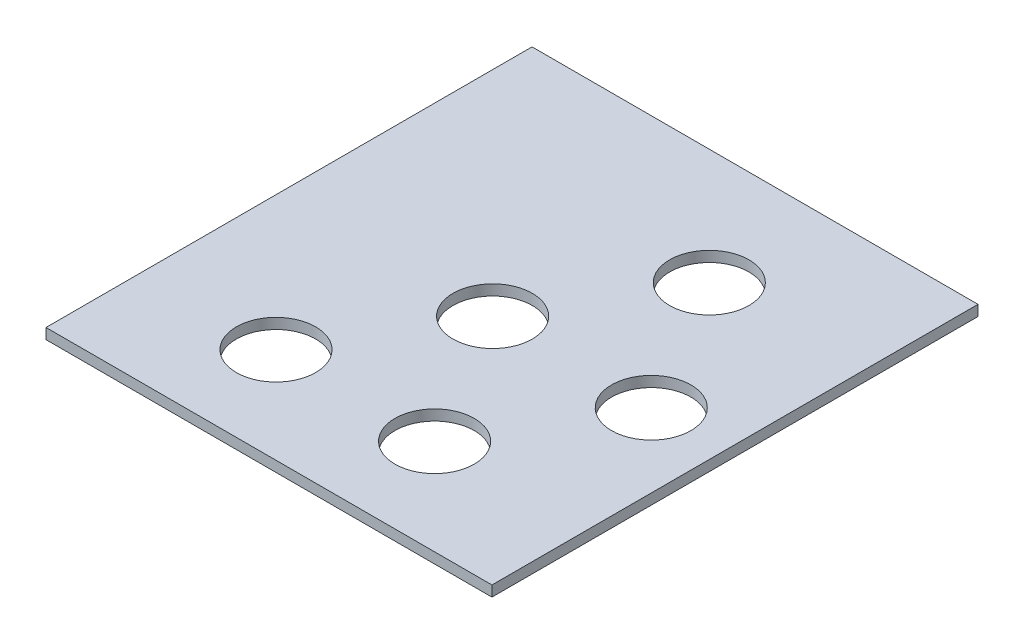
ISO-10303-21;
HEADER;
FILE_DESCRIPTION(('STEP AP214'),'2;1');
FILE_NAME('part.step','',(''),(''),'','','');
FILE_SCHEMA(('AUTOMOTIVE_DESIGN { 1 0 10303 214 1 1 1 1 }'));
ENDSEC;
DATA;
#1=APPLICATION_CONTEXT('core data for automotive mechanical design processes');
#2=APPLICATION_PROTOCOL_DEFINITION('international standard','automotive_design',2000,#1);
#3=PRODUCT_CONTEXT('',#1,'mechanical');
#4=PRODUCT('Part','Part','',(#3));
#5=PRODUCT_RELATED_PRODUCT_CATEGORY('part','',(#4));
#6=PRODUCT_DEFINITION_FORMATION('','',#4);
#7=PRODUCT_DEFINITION_CONTEXT('part definition',#1,'design');
#8=PRODUCT_DEFINITION('design','',#6,#7);
#9=PRODUCT_DEFINITION_SHAPE('','',#8);
#10=(LENGTH_UNIT() NAMED_UNIT(*) SI_UNIT(.MILLI.,.METRE.));
#11=(NAMED_UNIT(*) PLANE_ANGLE_UNIT() SI_UNIT($,.RADIAN.));
#12=(NAMED_UNIT(*) SI_UNIT($,.STERADIAN.) SOLID_ANGLE_UNIT());
#13=UNCERTAINTY_MEASURE_WITH_UNIT(LENGTH_MEASURE(1.E-05),#10,'distance_accuracy_value','');
#14=(GEOMETRIC_REPRESENTATION_CONTEXT(3) GLOBAL_UNCERTAINTY_ASSIGNED_CONTEXT((#13)) GLOBAL_UNIT_ASSIGNED_CONTEXT((#10,
#11,#12)) REPRESENTATION_CONTEXT('',''));
#15=CARTESIAN_POINT('',(0.,0.,0.));
#16=DIRECTION('',(0.,0.,1.));
#17=DIRECTION('',(1.,0.,0.));
#18=AXIS2_PLACEMENT_3D('',#15,#16,#17);
#19=CARTESIAN_POINT('',(0.,1.6,0.));
#20=DIRECTION('',(0.,1.,0.));
#21=DIRECTION('',(0.,0.,1.));
#22=AXIS2_PLACEMENT_3D('',#19,#20,#21);
#23=PLANE('',#22);
#24=CARTESIAN_POINT('',(-12.,1.6,6.92820323027551));
#25=DIRECTION('',(0.,1.,0.));
#26=DIRECTION('',(0.,0.,1.));
#27=AXIS2_PLACEMENT_3D('',#24,#25,#26);
#28=CIRCLE('',#27,5.99999999999998);
#29=CARTESIAN_POINT('',(-12.,1.6,12.9282032302755));
#30=VERTEX_POINT('',#29);
#31=EDGE_CURVE('E127',#30,#30,#28,.T.);
#32=ORIENTED_EDGE('',*,*,#31,.F.);
#33=EDGE_LOOP('',(#32));
#34=FACE_BOUND('',#33,.T.);
#35=CARTESIAN_POINT('',(24.,1.6,-13.856406460551));
#36=DIRECTION('',(0.,1.,0.));
#37=DIRECTION('',(0.,0.,1.));
#38=AXIS2_PLACEMENT_3D('',#35,#36,#37);
#39=CIRCLE('',#38,5.99999999999998);
#40=CARTESIAN_POINT('',(24.,1.6,-7.85640646055103));
#41=VERTEX_POINT('',#40);
#42=EDGE_CURVE('E115',#41,#41,#39,.T.);
#43=ORIENTED_EDGE('',*,*,#42,.F.);
#44=EDGE_LOOP('',(#43));
#45=FACE_BOUND('',#44,.T.);
#46=DIRECTION('',(0.,0.,1.));
#47=VECTOR('',#46,1.);
#48=CARTESIAN_POINT('',(-32.3149824931724,1.6,-52.1328433896002));
#49=LINE('',#48,#47);
#50=CARTESIAN_POINT('',(-32.3149824931724,1.6,-52.1328433896002));
#51=VERTEX_POINT('',#50);
#52=CARTESIAN_POINT('',(-32.3149824931724,1.6,21.4172354848299));
#53=VERTEX_POINT('',#52);
#54=EDGE_CURVE('E85',#51,#53,#49,.T.);
#55=ORIENTED_EDGE('',*,*,#54,.T.);
#56=DIRECTION('',(1.,0.,0.));
#57=VECTOR('',#56,1.);
#58=CARTESIAN_POINT('',(-32.3149824931724,1.6,21.4172354848299));
#59=LINE('',#58,#57);
#60=CARTESIAN_POINT('',(35.168799363241,1.6,21.4172354848299));
#61=VERTEX_POINT('',#60);
#62=EDGE_CURVE('E80',#53,#61,#59,.T.);
#63=ORIENTED_EDGE('',*,*,#62,.T.);
#64=DIRECTION('',(0.,0.,-1.));
#65=VECTOR('',#64,1.);
#66=CARTESIAN_POINT('',(35.168799363241,1.6,-52.1328433896002));
#67=LINE('',#66,#65);
#68=CARTESIAN_POINT('',(35.168799363241,1.6,-52.1328433896002));
#69=VERTEX_POINT('',#68);
#70=EDGE_CURVE('E83',#61,#69,#67,.T.);
#71=ORIENTED_EDGE('',*,*,#70,.T.);
#72=DIRECTION('',(-1.,0.,0.));
#73=VECTOR('',#72,1.);
#74=CARTESIAN_POINT('',(-32.3149824931724,1.6,-52.1328433896002));
#75=LINE('',#74,#73);
#76=EDGE_CURVE('E50',#69,#51,#75,.T.);
#77=ORIENTED_EDGE('',*,*,#76,.T.);
#78=EDGE_LOOP('',(#55,#63,#71,#77));
#79=FACE_BOUND('',#78,.T.);
#80=CARTESIAN_POINT('',(0.,1.6,-13.856406460551));
#81=DIRECTION('',(0.,1.,0.));
#82=DIRECTION('',(0.,0.,1.));
#83=AXIS2_PLACEMENT_3D('',#80,#81,#82);
#84=CIRCLE('',#83,6.00000000000005);
#85=CARTESIAN_POINT('',(0.,1.6,-7.85640646055097));
#86=VERTEX_POINT('',#85);
#87=EDGE_CURVE('E100',#86,#86,#84,.T.);
#88=ORIENTED_EDGE('',*,*,#87,.F.);
#89=EDGE_LOOP('',(#88));
#90=FACE_BOUND('',#89,.T.);
#91=CARTESIAN_POINT('',(12.,1.6,6.92820323027551));
#92=DIRECTION('',(0.,1.,0.));
#93=DIRECTION('',(0.,0.,1.));
#94=AXIS2_PLACEMENT_3D('',#91,#92,#93);
#95=CIRCLE('',#94,5.99999999999998);
#96=CARTESIAN_POINT('',(12.,1.6,12.9282032302755));
#97=VERTEX_POINT('',#96);
#98=EDGE_CURVE('E121',#97,#97,#95,.T.);
#99=ORIENTED_EDGE('',*,*,#98,.F.);
#100=EDGE_LOOP('',(#99));
#101=FACE_BOUND('',#100,.T.);
#102=CARTESIAN_POINT('',(12.,1.6,-34.6410161513776));
#103=DIRECTION('',(0.,1.,0.));
#104=DIRECTION('',(0.,0.,1.));
#105=AXIS2_PLACEMENT_3D('',#102,#103,#104);
#106=CIRCLE('',#105,6.);
#107=CARTESIAN_POINT('',(12.,1.6,-28.6410161513776));
#108=VERTEX_POINT('',#107);
#109=EDGE_CURVE('E133',#108,#108,#106,.T.);
#110=ORIENTED_EDGE('',*,*,#109,.F.);
#111=EDGE_LOOP('',(#110));
#112=FACE_BOUND('',#111,.T.);
#113=ADVANCED_FACE('F33',(#34,#45,#79,#90,#101,#112),#23,.T.);
#114=CARTESIAN_POINT('',(0.,0.,0.));
#115=DIRECTION('',(0.,1.,0.));
#116=DIRECTION('',(0.,0.,1.));
#117=AXIS2_PLACEMENT_3D('',#114,#115,#116);
#118=PLANE('',#117);
#119=CARTESIAN_POINT('',(-12.,0.,6.92820323027551));
#120=DIRECTION('',(0.,1.,0.));
#121=DIRECTION('',(0.,0.,1.));
#122=AXIS2_PLACEMENT_3D('',#119,#120,#121);
#123=CIRCLE('',#122,5.99999999999998);
#124=CARTESIAN_POINT('',(-12.,0.,12.9282032302755));
#125=VERTEX_POINT('',#124);
#126=EDGE_CURVE('E130',#125,#125,#123,.T.);
#127=ORIENTED_EDGE('',*,*,#126,.T.);
#128=EDGE_LOOP('',(#127));
#129=FACE_BOUND('',#128,.T.);
#130=CARTESIAN_POINT('',(24.,0.,-13.856406460551));
#131=DIRECTION('',(0.,1.,0.));
#132=DIRECTION('',(0.,0.,1.));
#133=AXIS2_PLACEMENT_3D('',#130,#131,#132);
#134=CIRCLE('',#133,5.99999999999998);
#135=CARTESIAN_POINT('',(24.,0.,-7.85640646055103));
#136=VERTEX_POINT('',#135);
#137=EDGE_CURVE('E118',#136,#136,#134,.T.);
#138=ORIENTED_EDGE('',*,*,#137,.T.);
#139=EDGE_LOOP('',(#138));
#140=FACE_BOUND('',#139,.T.);
#141=DIRECTION('',(0.,0.,1.));
#142=VECTOR('',#141,1.);
#143=CARTESIAN_POINT('',(-32.3149824931724,0.,-52.1328433896002));
#144=LINE('',#143,#142);
#145=CARTESIAN_POINT('',(-32.3149824931724,0.,-52.1328433896002));
#146=VERTEX_POINT('',#145);
#147=CARTESIAN_POINT('',(-32.3149824931724,0.,21.4172354848299));
#148=VERTEX_POINT('',#147);
#149=EDGE_CURVE('E97',#146,#148,#144,.T.);
#150=ORIENTED_EDGE('',*,*,#149,.F.);
#151=DIRECTION('',(-1.,0.,0.));
#152=VECTOR('',#151,1.);
#153=CARTESIAN_POINT('',(-32.3149824931724,0.,-52.1328433896002));
#154=LINE('',#153,#152);
#155=CARTESIAN_POINT('',(35.168799363241,0.,-52.1328433896002));
#156=VERTEX_POINT('',#155);
#157=EDGE_CURVE('E73',#156,#146,#154,.T.);
#158=ORIENTED_EDGE('',*,*,#157,.F.);
#159=DIRECTION('',(0.,0.,-1.));
#160=VECTOR('',#159,1.);
#161=CARTESIAN_POINT('',(35.168799363241,0.,-52.1328433896002));
#162=LINE('',#161,#160);
#163=CARTESIAN_POINT('',(35.168799363241,0.,21.4172354848299));
#164=VERTEX_POINT('',#163);
#165=EDGE_CURVE('E67',#164,#156,#162,.T.);
#166=ORIENTED_EDGE('',*,*,#165,.F.);
#167=DIRECTION('',(1.,0.,0.));
#168=VECTOR('',#167,1.);
#169=CARTESIAN_POINT('',(-32.3149824931724,0.,21.4172354848299));
#170=LINE('',#169,#168);
#171=EDGE_CURVE('E89',#148,#164,#170,.T.);
#172=ORIENTED_EDGE('',*,*,#171,.F.);
#173=EDGE_LOOP('',(#150,#158,#166,#172));
#174=FACE_BOUND('',#173,.T.);
#175=CARTESIAN_POINT('',(0.,0.,-13.856406460551));
#176=DIRECTION('',(0.,1.,0.));
#177=DIRECTION('',(0.,0.,1.));
#178=AXIS2_PLACEMENT_3D('',#175,#176,#177);
#179=CIRCLE('',#178,6.00000000000005);
#180=CARTESIAN_POINT('',(0.,0.,-7.85640646055097));
#181=VERTEX_POINT('',#180);
#182=EDGE_CURVE('E112',#181,#181,#179,.T.);
#183=ORIENTED_EDGE('',*,*,#182,.T.);
#184=EDGE_LOOP('',(#183));
#185=FACE_BOUND('',#184,.T.);
#186=CARTESIAN_POINT('',(12.,0.,6.92820323027551));
#187=DIRECTION('',(0.,1.,0.));
#188=DIRECTION('',(0.,0.,1.));
#189=AXIS2_PLACEMENT_3D('',#186,#187,#188);
#190=CIRCLE('',#189,5.99999999999998);
#191=CARTESIAN_POINT('',(12.,0.,12.9282032302755));
#192=VERTEX_POINT('',#191);
#193=EDGE_CURVE('E124',#192,#192,#190,.T.);
#194=ORIENTED_EDGE('',*,*,#193,.T.);
#195=EDGE_LOOP('',(#194));
#196=FACE_BOUND('',#195,.T.);
#197=CARTESIAN_POINT('',(12.,0.,-34.6410161513776));
#198=DIRECTION('',(0.,1.,0.));
#199=DIRECTION('',(0.,0.,1.));
#200=AXIS2_PLACEMENT_3D('',#197,#198,#199);
#201=CIRCLE('',#200,6.);
#202=CARTESIAN_POINT('',(12.,0.,-28.6410161513776));
#203=VERTEX_POINT('',#202);
#204=EDGE_CURVE('E136',#203,#203,#201,.T.);
#205=ORIENTED_EDGE('',*,*,#204,.T.);
#206=EDGE_LOOP('',(#205));
#207=FACE_BOUND('',#206,.T.);
#208=ADVANCED_FACE('F108',(#129,#140,#174,#185,#196,#207),#118,.F.);
#209=CARTESIAN_POINT('',(-32.3149824931724,1.6,-52.1328433896002));
#210=DIRECTION('',(1.,0.,0.));
#211=DIRECTION('',(0.,0.,-1.));
#212=AXIS2_PLACEMENT_3D('',#209,#210,#211);
#213=PLANE('',#212);
#214=ORIENTED_EDGE('',*,*,#149,.T.);
#215=DIRECTION('',(0.,-1.,0.));
#216=VECTOR('',#215,1.);
#217=CARTESIAN_POINT('',(-32.3149824931724,1.6,21.4172354848299));
#218=LINE('',#217,#216);
#219=EDGE_CURVE('E11',#53,#148,#218,.T.);
#220=ORIENTED_EDGE('',*,*,#219,.F.);
#221=ORIENTED_EDGE('',*,*,#54,.F.);
#222=DIRECTION('',(0.,-1.,0.));
#223=VECTOR('',#222,1.);
#224=CARTESIAN_POINT('',(-32.3149824931724,1.6,-52.1328433896002));
#225=LINE('',#224,#223);
#226=EDGE_CURVE('E93',#51,#146,#225,.T.);
#227=ORIENTED_EDGE('',*,*,#226,.T.);
#228=EDGE_LOOP('',(#214,#220,#221,#227));
#229=FACE_BOUND('',#228,.T.);
#230=ADVANCED_FACE('F35',(#229),#213,.F.);
#231=CARTESIAN_POINT('',(-32.3149824931724,1.6,21.4172354848299));
#232=DIRECTION('',(0.,0.,-1.));
#233=DIRECTION('',(-1.,0.,0.));
#234=AXIS2_PLACEMENT_3D('',#231,#232,#233);
#235=PLANE('',#234);
#236=ORIENTED_EDGE('',*,*,#171,.T.);
#237=DIRECTION('',(0.,-1.,0.));
#238=VECTOR('',#237,1.);
#239=CARTESIAN_POINT('',(35.168799363241,1.6,21.4172354848299));
#240=LINE('',#239,#238);
#241=EDGE_CURVE('E42',#61,#164,#240,.T.);
#242=ORIENTED_EDGE('',*,*,#241,.F.);
#243=ORIENTED_EDGE('',*,*,#62,.F.);
#244=ORIENTED_EDGE('',*,*,#219,.T.);
#245=EDGE_LOOP('',(#236,#242,#243,#244));
#246=FACE_BOUND('',#245,.T.);
#247=ADVANCED_FACE('F88',(#246),#235,.F.);
#248=CARTESIAN_POINT('',(35.168799363241,1.6,-52.1328433896002));
#249=DIRECTION('',(-1.,0.,0.));
#250=DIRECTION('',(0.,0.,1.));
#251=AXIS2_PLACEMENT_3D('',#248,#249,#250);
#252=PLANE('',#251);
#253=ORIENTED_EDGE('',*,*,#165,.T.);
#254=DIRECTION('',(0.,-1.,0.));
#255=VECTOR('',#254,1.);
#256=CARTESIAN_POINT('',(35.168799363241,1.6,-52.1328433896002));
#257=LINE('',#256,#255);
#258=EDGE_CURVE('E90',#69,#156,#257,.T.);
#259=ORIENTED_EDGE('',*,*,#258,.F.);
#260=ORIENTED_EDGE('',*,*,#70,.F.);
#261=ORIENTED_EDGE('',*,*,#241,.T.);
#262=EDGE_LOOP('',(#253,#259,#260,#261));
#263=FACE_BOUND('',#262,.T.);
#264=ADVANCED_FACE('F91',(#263),#252,.F.);
#265=CARTESIAN_POINT('',(-32.3149824931724,1.6,-52.1328433896002));
#266=DIRECTION('',(0.,0.,1.));
#267=DIRECTION('',(1.,0.,0.));
#268=AXIS2_PLACEMENT_3D('',#265,#266,#267);
#269=PLANE('',#268);
#270=ORIENTED_EDGE('',*,*,#157,.T.);
#271=ORIENTED_EDGE('',*,*,#226,.F.);
#272=ORIENTED_EDGE('',*,*,#76,.F.);
#273=ORIENTED_EDGE('',*,*,#258,.T.);
#274=EDGE_LOOP('',(#270,#271,#272,#273));
#275=FACE_BOUND('',#274,.T.);
#276=ADVANCED_FACE('F105',(#275),#269,.F.);
#277=CARTESIAN_POINT('',(0.,1.6,-13.856406460551));
#278=DIRECTION('',(0.,-1.,0.));
#279=DIRECTION('',(0.,0.,-1.));
#280=AXIS2_PLACEMENT_3D('',#277,#278,#279);
#281=CYLINDRICAL_SURFACE('',#280,6.00000000000005);
#282=ORIENTED_EDGE('',*,*,#87,.T.);
#283=EDGE_LOOP('',(#282));
#284=FACE_BOUND('',#283,.T.);
#285=ORIENTED_EDGE('',*,*,#182,.F.);
#286=EDGE_LOOP('',(#285));
#287=FACE_BOUND('',#286,.T.);
#288=ADVANCED_FACE('F156',(#284,#287),#281,.F.);
#289=CARTESIAN_POINT('',(24.,1.6,-13.856406460551));
#290=DIRECTION('',(0.,-1.,0.));
#291=DIRECTION('',(0.,0.,-1.));
#292=AXIS2_PLACEMENT_3D('',#289,#290,#291);
#293=CYLINDRICAL_SURFACE('',#292,5.99999999999998);
#294=ORIENTED_EDGE('',*,*,#42,.T.);
#295=EDGE_LOOP('',(#294));
#296=FACE_BOUND('',#295,.T.);
#297=ORIENTED_EDGE('',*,*,#137,.F.);
#298=EDGE_LOOP('',(#297));
#299=FACE_BOUND('',#298,.T.);
#300=ADVANCED_FACE('F202',(#296,#299),#293,.F.);
#301=CARTESIAN_POINT('',(12.,1.6,6.92820323027551));
#302=DIRECTION('',(0.,-1.,0.));
#303=DIRECTION('',(0.,0.,-1.));
#304=AXIS2_PLACEMENT_3D('',#301,#302,#303);
#305=CYLINDRICAL_SURFACE('',#304,5.99999999999998);
#306=ORIENTED_EDGE('',*,*,#98,.T.);
#307=EDGE_LOOP('',(#306));
#308=FACE_BOUND('',#307,.T.);
#309=ORIENTED_EDGE('',*,*,#193,.F.);
#310=EDGE_LOOP('',(#309));
#311=FACE_BOUND('',#310,.T.);
#312=ADVANCED_FACE('F210',(#308,#311),#305,.F.);
#313=CARTESIAN_POINT('',(-12.,1.6,6.92820323027551));
#314=DIRECTION('',(0.,-1.,0.));
#315=DIRECTION('',(0.,0.,-1.));
#316=AXIS2_PLACEMENT_3D('',#313,#314,#315);
#317=CYLINDRICAL_SURFACE('',#316,5.99999999999998);
#318=ORIENTED_EDGE('',*,*,#31,.T.);
#319=EDGE_LOOP('',(#318));
#320=FACE_BOUND('',#319,.T.);
#321=ORIENTED_EDGE('',*,*,#126,.F.);
#322=EDGE_LOOP('',(#321));
#323=FACE_BOUND('',#322,.T.);
#324=ADVANCED_FACE('F218',(#320,#323),#317,.F.);
#325=CARTESIAN_POINT('',(12.,1.6,-34.6410161513776));
#326=DIRECTION('',(0.,-1.,0.));
#327=DIRECTION('',(0.,0.,-1.));
#328=AXIS2_PLACEMENT_3D('',#325,#326,#327);
#329=CYLINDRICAL_SURFACE('',#328,6.);
#330=ORIENTED_EDGE('',*,*,#109,.T.);
#331=EDGE_LOOP('',(#330));
#332=FACE_BOUND('',#331,.T.);
#333=ORIENTED_EDGE('',*,*,#204,.F.);
#334=EDGE_LOOP('',(#333));
#335=FACE_BOUND('',#334,.T.);
#336=ADVANCED_FACE('F142',(#332,#335),#329,.F.);
#337=CLOSED_SHELL('',(#113,#208,#230,#247,#264,#276,#288,#300,#312,#324,#336));
#338=MANIFOLD_SOLID_BREP('B2',#337);
#339=ADVANCED_BREP_SHAPE_REPRESENTATION('',(#18,#338),#14);
#340=SHAPE_DEFINITION_REPRESENTATION(#9,#339);
ENDSEC;
END-ISO-10303-21;
